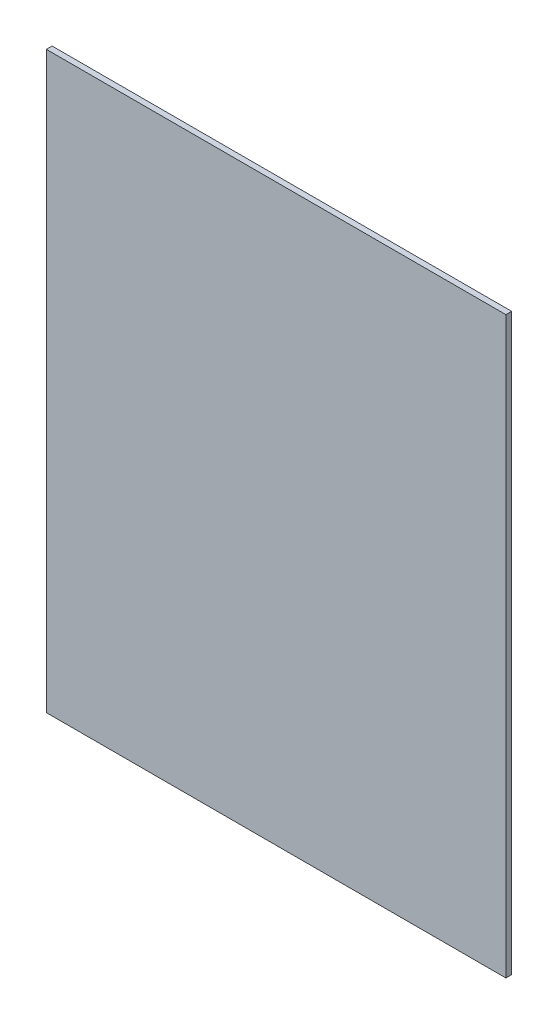
ISO-10303-21;
HEADER;
FILE_DESCRIPTION(('STEP AP214'),'2;1');
FILE_NAME('part.step','',(''),(''),'','','');
FILE_SCHEMA(('AUTOMOTIVE_DESIGN { 1 0 10303 214 1 1 1 1 }'));
ENDSEC;
DATA;
#1=APPLICATION_CONTEXT('core data for automotive mechanical design processes');
#2=APPLICATION_PROTOCOL_DEFINITION('international standard','automotive_design',2000,#1);
#3=PRODUCT_CONTEXT('',#1,'mechanical');
#4=PRODUCT('Part','Part','',(#3));
#5=PRODUCT_RELATED_PRODUCT_CATEGORY('part','',(#4));
#6=PRODUCT_DEFINITION_FORMATION('','',#4);
#7=PRODUCT_DEFINITION_CONTEXT('part definition',#1,'design');
#8=PRODUCT_DEFINITION('design','',#6,#7);
#9=PRODUCT_DEFINITION_SHAPE('','',#8);
#10=(LENGTH_UNIT() NAMED_UNIT(*) SI_UNIT(.MILLI.,.METRE.));
#11=(NAMED_UNIT(*) PLANE_ANGLE_UNIT() SI_UNIT($,.RADIAN.));
#12=(NAMED_UNIT(*) SI_UNIT($,.STERADIAN.) SOLID_ANGLE_UNIT());
#13=UNCERTAINTY_MEASURE_WITH_UNIT(LENGTH_MEASURE(1.E-05),#10,'distance_accuracy_value','');
#14=(GEOMETRIC_REPRESENTATION_CONTEXT(3) GLOBAL_UNCERTAINTY_ASSIGNED_CONTEXT((#13)) GLOBAL_UNIT_ASSIGNED_CONTEXT((#10,
#11,#12)) REPRESENTATION_CONTEXT('',''));
#15=CARTESIAN_POINT('',(0.,0.,0.));
#16=DIRECTION('',(0.,0.,1.));
#17=DIRECTION('',(1.,0.,0.));
#18=AXIS2_PLACEMENT_3D('',#15,#16,#17);
#19=CARTESIAN_POINT('',(0.,0.,4.));
#20=DIRECTION('',(1.,0.,0.));
#21=DIRECTION('',(0.,0.,-1.));
#22=AXIS2_PLACEMENT_3D('',#19,#20,#21);
#23=PLANE('',#22);
#24=DIRECTION('',(0.,-1.,0.));
#25=VECTOR('',#24,1.);
#26=CARTESIAN_POINT('',(0.,0.,0.));
#27=LINE('',#26,#25);
#28=CARTESIAN_POINT('',(0.,400.,0.));
#29=VERTEX_POINT('',#28);
#30=CARTESIAN_POINT('',(0.,0.,0.));
#31=VERTEX_POINT('',#30);
#32=EDGE_CURVE('E97',#29,#31,#27,.T.);
#33=ORIENTED_EDGE('',*,*,#32,.T.);
#34=DIRECTION('',(0.,0.,-1.));
#35=VECTOR('',#34,1.);
#36=CARTESIAN_POINT('',(0.,0.,4.));
#37=LINE('',#36,#35);
#38=CARTESIAN_POINT('',(0.,0.,4.));
#39=VERTEX_POINT('',#38);
#40=EDGE_CURVE('E11',#39,#31,#37,.T.);
#41=ORIENTED_EDGE('',*,*,#40,.F.);
#42=DIRECTION('',(0.,-1.,0.));
#43=VECTOR('',#42,1.);
#44=CARTESIAN_POINT('',(0.,0.,4.));
#45=LINE('',#44,#43);
#46=CARTESIAN_POINT('',(0.,400.,4.));
#47=VERTEX_POINT('',#46);
#48=EDGE_CURVE('E85',#47,#39,#45,.T.);
#49=ORIENTED_EDGE('',*,*,#48,.F.);
#50=DIRECTION('',(0.,0.,-1.));
#51=VECTOR('',#50,1.);
#52=CARTESIAN_POINT('',(0.,400.,4.));
#53=LINE('',#52,#51);
#54=EDGE_CURVE('E93',#47,#29,#53,.T.);
#55=ORIENTED_EDGE('',*,*,#54,.T.);
#56=EDGE_LOOP('',(#33,#41,#49,#55));
#57=FACE_BOUND('',#56,.T.);
#58=ADVANCED_FACE('F34',(#57),#23,.F.);
#59=CARTESIAN_POINT('',(0.,0.,4.));
#60=DIRECTION('',(0.,1.,0.));
#61=DIRECTION('',(0.,0.,1.));
#62=AXIS2_PLACEMENT_3D('',#59,#60,#61);
#63=PLANE('',#62);
#64=DIRECTION('',(1.,0.,0.));
#65=VECTOR('',#64,1.);
#66=CARTESIAN_POINT('',(0.,0.,0.));
#67=LINE('',#66,#65);
#68=CARTESIAN_POINT('',(320.,0.,0.));
#69=VERTEX_POINT('',#68);
#70=EDGE_CURVE('E89',#31,#69,#67,.T.);
#71=ORIENTED_EDGE('',*,*,#70,.T.);
#72=DIRECTION('',(0.,0.,-1.));
#73=VECTOR('',#72,1.);
#74=CARTESIAN_POINT('',(320.,0.,4.));
#75=LINE('',#74,#73);
#76=CARTESIAN_POINT('',(320.,0.,4.));
#77=VERTEX_POINT('',#76);
#78=EDGE_CURVE('E42',#77,#69,#75,.T.);
#79=ORIENTED_EDGE('',*,*,#78,.F.);
#80=DIRECTION('',(1.,0.,0.));
#81=VECTOR('',#80,1.);
#82=CARTESIAN_POINT('',(0.,0.,4.));
#83=LINE('',#82,#81);
#84=EDGE_CURVE('E80',#39,#77,#83,.T.);
#85=ORIENTED_EDGE('',*,*,#84,.F.);
#86=ORIENTED_EDGE('',*,*,#40,.T.);
#87=EDGE_LOOP('',(#71,#79,#85,#86));
#88=FACE_BOUND('',#87,.T.);
#89=ADVANCED_FACE('F88',(#88),#63,.F.);
#90=CARTESIAN_POINT('',(320.,0.,4.));
#91=DIRECTION('',(-1.,0.,0.));
#92=DIRECTION('',(0.,0.,1.));
#93=AXIS2_PLACEMENT_3D('',#90,#91,#92);
#94=PLANE('',#93);
#95=DIRECTION('',(0.,1.,0.));
#96=VECTOR('',#95,1.);
#97=CARTESIAN_POINT('',(320.,0.,0.));
#98=LINE('',#97,#96);
#99=CARTESIAN_POINT('',(320.,400.,0.));
#100=VERTEX_POINT('',#99);
#101=EDGE_CURVE('E67',#69,#100,#98,.T.);
#102=ORIENTED_EDGE('',*,*,#101,.T.);
#103=DIRECTION('',(0.,0.,-1.));
#104=VECTOR('',#103,1.);
#105=CARTESIAN_POINT('',(320.,400.,4.));
#106=LINE('',#105,#104);
#107=CARTESIAN_POINT('',(320.,400.,4.));
#108=VERTEX_POINT('',#107);
#109=EDGE_CURVE('E90',#108,#100,#106,.T.);
#110=ORIENTED_EDGE('',*,*,#109,.F.);
#111=DIRECTION('',(0.,1.,0.));
#112=VECTOR('',#111,1.);
#113=CARTESIAN_POINT('',(320.,0.,4.));
#114=LINE('',#113,#112);
#115=EDGE_CURVE('E83',#77,#108,#114,.T.);
#116=ORIENTED_EDGE('',*,*,#115,.F.);
#117=ORIENTED_EDGE('',*,*,#78,.T.);
#118=EDGE_LOOP('',(#102,#110,#116,#117));
#119=FACE_BOUND('',#118,.T.);
#120=ADVANCED_FACE('F91',(#119),#94,.F.);
#121=CARTESIAN_POINT('',(0.,400.,4.));
#122=DIRECTION('',(0.,-1.,0.));
#123=DIRECTION('',(0.,0.,-1.));
#124=AXIS2_PLACEMENT_3D('',#121,#122,#123);
#125=PLANE('',#124);
#126=DIRECTION('',(-1.,0.,0.));
#127=VECTOR('',#126,1.);
#128=CARTESIAN_POINT('',(0.,400.,0.));
#129=LINE('',#128,#127);
#130=EDGE_CURVE('E73',#100,#29,#129,.T.);
#131=ORIENTED_EDGE('',*,*,#130,.T.);
#132=ORIENTED_EDGE('',*,*,#54,.F.);
#133=DIRECTION('',(-1.,0.,0.));
#134=VECTOR('',#133,1.);
#135=CARTESIAN_POINT('',(0.,400.,4.));
#136=LINE('',#135,#134);
#137=EDGE_CURVE('E50',#108,#47,#136,.T.);
#138=ORIENTED_EDGE('',*,*,#137,.F.);
#139=ORIENTED_EDGE('',*,*,#109,.T.);
#140=EDGE_LOOP('',(#131,#132,#138,#139));
#141=FACE_BOUND('',#140,.T.);
#142=ADVANCED_FACE('F104',(#141),#125,.F.);
#143=CARTESIAN_POINT('',(0.,400.,4.));
#144=DIRECTION('',(0.,0.,-1.));
#145=DIRECTION('',(-1.,0.,0.));
#146=AXIS2_PLACEMENT_3D('',#143,#144,#145);
#147=PLANE('',#146);
#148=ORIENTED_EDGE('',*,*,#48,.T.);
#149=ORIENTED_EDGE('',*,*,#84,.T.);
#150=ORIENTED_EDGE('',*,*,#115,.T.);
#151=ORIENTED_EDGE('',*,*,#137,.T.);
#152=EDGE_LOOP('',(#148,#149,#150,#151));
#153=FACE_BOUND('',#152,.T.);
#154=ADVANCED_FACE('F81',(#153),#147,.F.);
#155=CARTESIAN_POINT('',(0.,400.,0.));
#156=DIRECTION('',(0.,0.,-1.));
#157=DIRECTION('',(-1.,0.,0.));
#158=AXIS2_PLACEMENT_3D('',#155,#156,#157);
#159=PLANE('',#158);
#160=ORIENTED_EDGE('',*,*,#32,.F.);
#161=ORIENTED_EDGE('',*,*,#130,.F.);
#162=ORIENTED_EDGE('',*,*,#101,.F.);
#163=ORIENTED_EDGE('',*,*,#70,.F.);
#164=EDGE_LOOP('',(#160,#161,#162,#163));
#165=FACE_BOUND('',#164,.T.);
#166=ADVANCED_FACE('F107',(#165),#159,.T.);
#167=CLOSED_SHELL('',(#58,#89,#120,#142,#154,#166));
#168=MANIFOLD_SOLID_BREP('B2',#167);
#169=ADVANCED_BREP_SHAPE_REPRESENTATION('',(#18,#168),#14);
#170=SHAPE_DEFINITION_REPRESENTATION(#9,#169);
ENDSEC;
END-ISO-10303-21;
